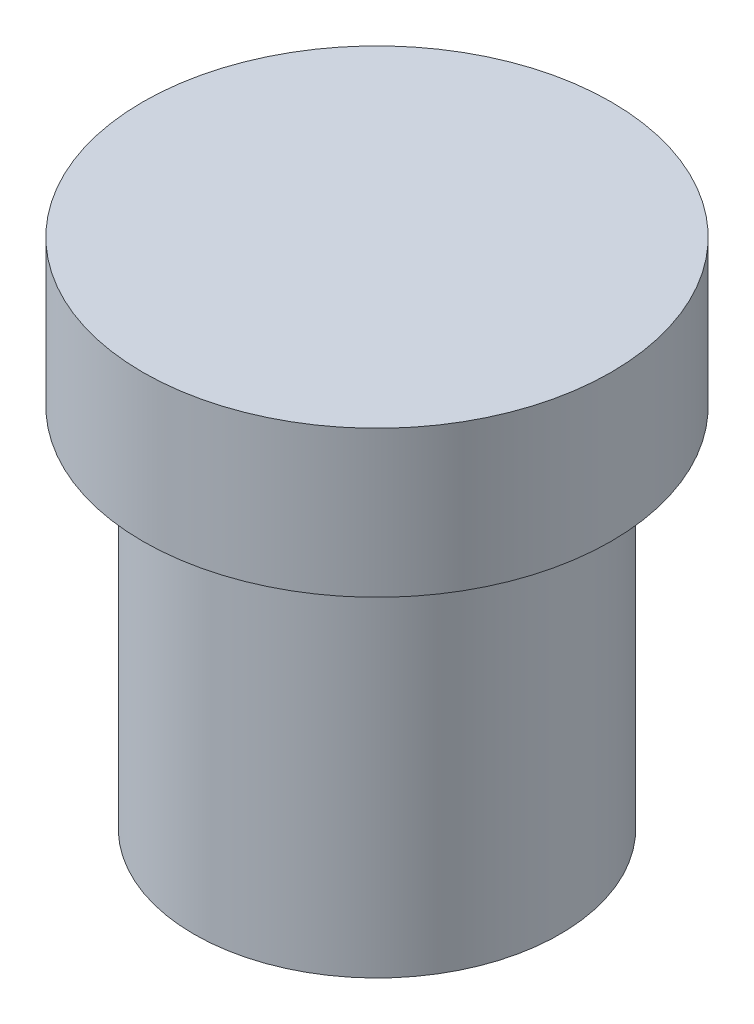
ISO-10303-21;
HEADER;
FILE_DESCRIPTION(('STEP AP214'),'2;1');
FILE_NAME('part.step','',(''),(''),'','','');
FILE_SCHEMA(('AUTOMOTIVE_DESIGN { 1 0 10303 214 1 1 1 1 }'));
ENDSEC;
DATA;
#1=APPLICATION_CONTEXT('core data for automotive mechanical design processes');
#2=APPLICATION_PROTOCOL_DEFINITION('international standard','automotive_design',2000,#1);
#3=PRODUCT_CONTEXT('',#1,'mechanical');
#4=PRODUCT('Part','Part','',(#3));
#5=PRODUCT_RELATED_PRODUCT_CATEGORY('part','',(#4));
#6=PRODUCT_DEFINITION_FORMATION('','',#4);
#7=PRODUCT_DEFINITION_CONTEXT('part definition',#1,'design');
#8=PRODUCT_DEFINITION('design','',#6,#7);
#9=PRODUCT_DEFINITION_SHAPE('','',#8);
#10=(LENGTH_UNIT() NAMED_UNIT(*) SI_UNIT(.MILLI.,.METRE.));
#11=(NAMED_UNIT(*) PLANE_ANGLE_UNIT() SI_UNIT($,.RADIAN.));
#12=(NAMED_UNIT(*) SI_UNIT($,.STERADIAN.) SOLID_ANGLE_UNIT());
#13=UNCERTAINTY_MEASURE_WITH_UNIT(LENGTH_MEASURE(1.E-05),#10,'distance_accuracy_value','');
#14=(GEOMETRIC_REPRESENTATION_CONTEXT(3) GLOBAL_UNCERTAINTY_ASSIGNED_CONTEXT((#13)) GLOBAL_UNIT_ASSIGNED_CONTEXT((#10,
#11,#12)) REPRESENTATION_CONTEXT('',''));
#15=CARTESIAN_POINT('',(0.,0.,0.));
#16=DIRECTION('',(0.,0.,1.));
#17=DIRECTION('',(1.,0.,0.));
#18=AXIS2_PLACEMENT_3D('',#15,#16,#17);
#19=CARTESIAN_POINT('',(0.,5.,0.));
#20=DIRECTION('',(0.,-1.,0.));
#21=DIRECTION('',(0.,0.,-1.));
#22=AXIS2_PLACEMENT_3D('',#19,#20,#21);
#23=CYLINDRICAL_SURFACE('',#22,2.5);
#24=CARTESIAN_POINT('',(0.,5.,0.));
#25=DIRECTION('',(0.,1.,0.));
#26=DIRECTION('',(0.,0.,1.));
#27=AXIS2_PLACEMENT_3D('',#24,#25,#26);
#28=CIRCLE('',#27,2.5);
#29=CARTESIAN_POINT('',(0.,5.,2.5));
#30=VERTEX_POINT('',#29);
#31=EDGE_CURVE('E10',#30,#30,#28,.T.);
#32=ORIENTED_EDGE('',*,*,#31,.F.);
#33=EDGE_LOOP('',(#32));
#34=FACE_BOUND('',#33,.T.);
#35=CARTESIAN_POINT('',(0.,0.,0.));
#36=DIRECTION('',(0.,1.,0.));
#37=DIRECTION('',(0.,0.,1.));
#38=AXIS2_PLACEMENT_3D('',#35,#36,#37);
#39=CIRCLE('',#38,2.5);
#40=CARTESIAN_POINT('',(0.,0.,2.5));
#41=VERTEX_POINT('',#40);
#42=EDGE_CURVE('E35',#41,#41,#39,.T.);
#43=ORIENTED_EDGE('',*,*,#42,.T.);
#44=EDGE_LOOP('',(#43));
#45=FACE_BOUND('',#44,.T.);
#46=ADVANCED_FACE('F32',(#34,#45),#23,.T.);
#47=CARTESIAN_POINT('',(0.,0.,0.));
#48=DIRECTION('',(0.,1.,0.));
#49=DIRECTION('',(0.,0.,1.));
#50=AXIS2_PLACEMENT_3D('',#47,#48,#49);
#51=PLANE('',#50);
#52=ORIENTED_EDGE('',*,*,#42,.F.);
#53=EDGE_LOOP('',(#52));
#54=FACE_BOUND('',#53,.T.);
#55=ADVANCED_FACE('F60',(#54),#51,.F.);
#56=CARTESIAN_POINT('',(0.,5.,0.));
#57=DIRECTION('',(0.,1.,0.));
#58=DIRECTION('',(0.,0.,1.));
#59=AXIS2_PLACEMENT_3D('',#56,#57,#58);
#60=PLANE('',#59);
#61=CARTESIAN_POINT('',(0.,5.,0.));
#62=DIRECTION('',(0.,1.,0.));
#63=DIRECTION('',(0.,0.,1.));
#64=AXIS2_PLACEMENT_3D('',#61,#62,#63);
#65=CIRCLE('',#64,3.2);
#66=CARTESIAN_POINT('',(0.,5.,3.2));
#67=VERTEX_POINT('',#66);
#68=EDGE_CURVE('E44',#67,#67,#65,.T.);
#69=ORIENTED_EDGE('',*,*,#68,.F.);
#70=EDGE_LOOP('',(#69));
#71=FACE_BOUND('',#70,.T.);
#72=ORIENTED_EDGE('',*,*,#31,.T.);
#73=EDGE_LOOP('',(#72));
#74=FACE_BOUND('',#73,.T.);
#75=ADVANCED_FACE('F55',(#71,#74),#60,.F.);
#76=CARTESIAN_POINT('',(0.,7.,0.));
#77=DIRECTION('',(0.,-1.,0.));
#78=DIRECTION('',(0.,0.,-1.));
#79=AXIS2_PLACEMENT_3D('',#76,#77,#78);
#80=CYLINDRICAL_SURFACE('',#79,3.2);
#81=CARTESIAN_POINT('',(0.,7.,0.));
#82=DIRECTION('',(0.,1.,0.));
#83=DIRECTION('',(0.,0.,1.));
#84=AXIS2_PLACEMENT_3D('',#81,#82,#83);
#85=CIRCLE('',#84,3.2);
#86=CARTESIAN_POINT('',(0.,7.,3.2));
#87=VERTEX_POINT('',#86);
#88=EDGE_CURVE('E42',#87,#87,#85,.T.);
#89=ORIENTED_EDGE('',*,*,#88,.F.);
#90=EDGE_LOOP('',(#89));
#91=FACE_BOUND('',#90,.T.);
#92=ORIENTED_EDGE('',*,*,#68,.T.);
#93=EDGE_LOOP('',(#92));
#94=FACE_BOUND('',#93,.T.);
#95=ADVANCED_FACE('F52',(#91,#94),#80,.T.);
#96=CARTESIAN_POINT('',(0.,7.,0.));
#97=DIRECTION('',(0.,1.,0.));
#98=DIRECTION('',(0.,0.,1.));
#99=AXIS2_PLACEMENT_3D('',#96,#97,#98);
#100=PLANE('',#99);
#101=ORIENTED_EDGE('',*,*,#88,.T.);
#102=EDGE_LOOP('',(#101));
#103=FACE_BOUND('',#102,.T.);
#104=ADVANCED_FACE('F50',(#103),#100,.T.);
#105=CLOSED_SHELL('',(#46,#55,#75,#95,#104));
#106=MANIFOLD_SOLID_BREP('B2',#105);
#107=ADVANCED_BREP_SHAPE_REPRESENTATION('',(#18,#106),#14);
#108=SHAPE_DEFINITION_REPRESENTATION(#9,#107);
ENDSEC;
END-ISO-10303-21;
